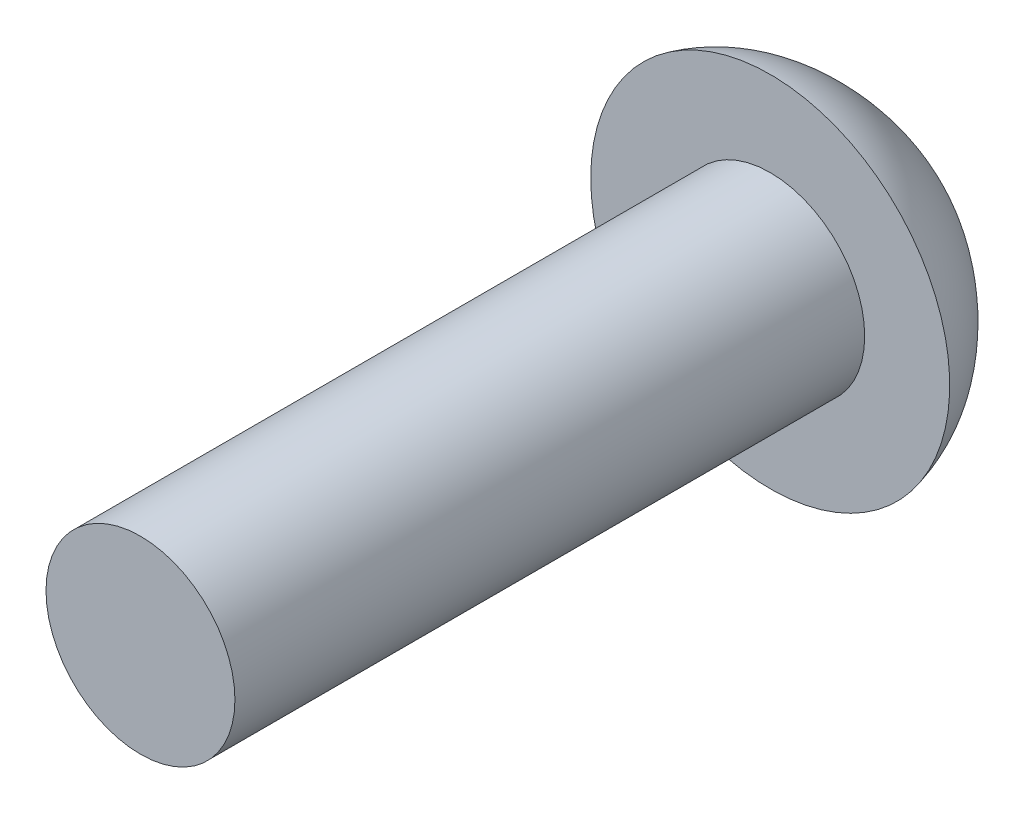
ISO-10303-21;
HEADER;
FILE_DESCRIPTION(('STEP AP214'),'2;1');
FILE_NAME('part.step','',(''),(''),'','','');
FILE_SCHEMA(('AUTOMOTIVE_DESIGN { 1 0 10303 214 1 1 1 1 }'));
ENDSEC;
DATA;
#1=APPLICATION_CONTEXT('core data for automotive mechanical design processes');
#2=APPLICATION_PROTOCOL_DEFINITION('international standard','automotive_design',2000,#1);
#3=PRODUCT_CONTEXT('',#1,'mechanical');
#4=PRODUCT('Part','Part','',(#3));
#5=PRODUCT_RELATED_PRODUCT_CATEGORY('part','',(#4));
#6=PRODUCT_DEFINITION_FORMATION('','',#4);
#7=PRODUCT_DEFINITION_CONTEXT('part definition',#1,'design');
#8=PRODUCT_DEFINITION('design','',#6,#7);
#9=PRODUCT_DEFINITION_SHAPE('','',#8);
#10=(LENGTH_UNIT() NAMED_UNIT(*) SI_UNIT(.MILLI.,.METRE.));
#11=(NAMED_UNIT(*) PLANE_ANGLE_UNIT() SI_UNIT($,.RADIAN.));
#12=(NAMED_UNIT(*) SI_UNIT($,.STERADIAN.) SOLID_ANGLE_UNIT());
#13=UNCERTAINTY_MEASURE_WITH_UNIT(LENGTH_MEASURE(1.E-05),#10,'distance_accuracy_value','');
#14=(GEOMETRIC_REPRESENTATION_CONTEXT(3) GLOBAL_UNCERTAINTY_ASSIGNED_CONTEXT((#13)) GLOBAL_UNIT_ASSIGNED_CONTEXT((#10,
#11,#12)) REPRESENTATION_CONTEXT('',''));
#15=CARTESIAN_POINT('',(0.,0.,0.));
#16=DIRECTION('',(0.,0.,1.));
#17=DIRECTION('',(1.,0.,0.));
#18=AXIS2_PLACEMENT_3D('',#15,#16,#17);
#19=CARTESIAN_POINT('',(0.,0.,0.));
#20=DIRECTION('',(0.,0.,-1.));
#21=DIRECTION('',(-1.,0.,0.));
#22=AXIS2_PLACEMENT_3D('',#19,#20,#21);
#23=PLANE('',#22);
#24=CARTESIAN_POINT('',(0.,0.,0.));
#25=DIRECTION('',(0.,0.,-1.));
#26=DIRECTION('',(-1.,0.,0.));
#27=AXIS2_PLACEMENT_3D('',#24,#25,#26);
#28=CIRCLE('',#27,1.5);
#29=CARTESIAN_POINT('',(-1.5,0.,0.));
#30=VERTEX_POINT('',#29);
#31=EDGE_CURVE('E11',#30,#30,#28,.T.);
#32=ORIENTED_EDGE('',*,*,#31,.F.);
#33=EDGE_LOOP('',(#32));
#34=FACE_BOUND('',#33,.T.);
#35=ADVANCED_FACE('F39',(#34),#23,.F.);
#36=CARTESIAN_POINT('',(0.,0.,-11.65));
#37=DIRECTION('',(0.,0.,-1.));
#38=DIRECTION('',(-1.,0.,0.));
#39=AXIS2_PLACEMENT_3D('',#36,#37,#38);
#40=CYLINDRICAL_SURFACE('',#39,1.5);
#41=CARTESIAN_POINT('',(0.,0.,-10.));
#42=DIRECTION('',(0.,0.,-1.));
#43=DIRECTION('',(-1.,0.,0.));
#44=AXIS2_PLACEMENT_3D('',#41,#42,#43);
#45=CIRCLE('',#44,1.5);
#46=CARTESIAN_POINT('',(-1.5,0.,-10.));
#47=VERTEX_POINT('',#46);
#48=EDGE_CURVE('E47',#47,#47,#45,.T.);
#49=ORIENTED_EDGE('',*,*,#48,.F.);
#50=EDGE_LOOP('',(#49));
#51=FACE_BOUND('',#50,.T.);
#52=ORIENTED_EDGE('',*,*,#31,.T.);
#53=EDGE_LOOP('',(#52));
#54=FACE_BOUND('',#53,.T.);
#55=ADVANCED_FACE('F181',(#51,#54),#40,.T.);
#56=CARTESIAN_POINT('',(1.5,0.,-10.));
#57=DIRECTION('',(0.,0.,-1.));
#58=DIRECTION('',(-1.,0.,0.));
#59=AXIS2_PLACEMENT_3D('',#56,#57,#58);
#60=PLANE('',#59);
#61=CARTESIAN_POINT('',(0.,0.,-10.));
#62=DIRECTION('',(0.,0.,-1.));
#63=DIRECTION('',(-1.,0.,0.));
#64=AXIS2_PLACEMENT_3D('',#61,#62,#63);
#65=CIRCLE('',#64,2.85);
#66=CARTESIAN_POINT('',(-2.85,0.,-10.));
#67=VERTEX_POINT('',#66);
#68=EDGE_CURVE('E195',#67,#67,#65,.T.);
#69=ORIENTED_EDGE('',*,*,#68,.F.);
#70=EDGE_LOOP('',(#69));
#71=FACE_BOUND('',#70,.T.);
#72=ORIENTED_EDGE('',*,*,#48,.T.);
#73=EDGE_LOOP('',(#72));
#74=FACE_BOUND('',#73,.T.);
#75=ADVANCED_FACE('F177',(#71,#74),#60,.F.);
#76=CARTESIAN_POINT('',(2.85,0.,-10.));
#77=CARTESIAN_POINT('',(2.63159564729313,0.,-10.9271725379561));
#78=CARTESIAN_POINT('',(1.5,0.,-11.65));
#79=B_SPLINE_CURVE_WITH_KNOTS('',2,(#76,#77,#78),.UNSPECIFIED.,.F.,.F.,(3,3),(0.,
0.48885509411615),.UNSPECIFIED.);
#80=CARTESIAN_POINT('',(0.,0.,-11.65));
#81=DIRECTION('',(0.,0.,-1.));
#82=AXIS1_PLACEMENT('',#80,#81);
#83=SURFACE_OF_REVOLUTION('',#79,#82);
#84=CARTESIAN_POINT('',(0.,0.,-11.65));
#85=DIRECTION('',(0.,0.,-1.));
#86=DIRECTION('',(-1.,0.,0.));
#87=AXIS2_PLACEMENT_3D('',#84,#85,#86);
#88=CIRCLE('',#87,1.5);
#89=CARTESIAN_POINT('',(-1.5,0.,-11.65));
#90=VERTEX_POINT('',#89);
#91=EDGE_CURVE('E153',#90,#90,#88,.T.);
#92=ORIENTED_EDGE('',*,*,#91,.F.);
#93=EDGE_LOOP('',(#92));
#94=FACE_BOUND('',#93,.T.);
#95=ORIENTED_EDGE('',*,*,#68,.T.);
#96=EDGE_LOOP('',(#95));
#97=FACE_BOUND('',#96,.T.);
#98=ADVANCED_FACE('F172',(#94,#97),#83,.T.);
#99=CARTESIAN_POINT('',(1.5,0.,-11.65));
#100=DIRECTION('',(0.,0.,1.));
#101=DIRECTION('',(1.,0.,0.));
#102=AXIS2_PLACEMENT_3D('',#99,#100,#101);
#103=PLANE('',#102);
#104=DIRECTION('',(0.999999896632299,-0.000454681637801801,0.));
#105=VECTOR('',#104,1.);
#106=CARTESIAN_POINT('',(-0.576895527872454,1.00026240719828,-11.65));
#107=LINE('',#106,#105);
#108=CARTESIAN_POINT('',(-0.576895527872454,1.00026240719828,-11.65));
#109=VERTEX_POINT('',#108);
#110=CARTESIAN_POINT('',(0.577804891148057,0.999737386066318,-11.65));
#111=VERTEX_POINT('',#110);
#112=EDGE_CURVE('E134',#109,#111,#107,.T.);
#113=ORIENTED_EDGE('',*,*,#112,.F.);
#114=DIRECTION('',(0.50039371416512,0.865797973446483,0.));
#115=VECTOR('',#114,1.);
#116=CARTESIAN_POINT('',(-1.15470041902051,0.000525021131960999,-11.65));
#117=LINE('',#116,#115);
#118=CARTESIAN_POINT('',(-1.15470041902051,0.000525021131960999,-11.65));
#119=VERTEX_POINT('',#118);
#120=EDGE_CURVE('E54',#119,#109,#117,.T.);
#121=ORIENTED_EDGE('',*,*,#120,.F.);
#122=DIRECTION('',(-0.499606182467179,0.866252655084284,0.));
#123=VECTOR('',#122,1.);
#124=CARTESIAN_POINT('',(-0.577804891148057,-0.999737386066318,-11.65));
#125=LINE('',#124,#123);
#126=CARTESIAN_POINT('',(-0.577804891148057,-0.999737386066318,-11.65));
#127=VERTEX_POINT('',#126);
#128=EDGE_CURVE('E147',#127,#119,#125,.T.);
#129=ORIENTED_EDGE('',*,*,#128,.F.);
#130=DIRECTION('',(-0.999999896632299,0.000454681637801989,0.));
#131=VECTOR('',#130,1.);
#132=CARTESIAN_POINT('',(0.576895527872454,-1.00026240719828,-11.65));
#133=LINE('',#132,#131);
#134=CARTESIAN_POINT('',(0.576895527872454,-1.00026240719828,-11.65));
#135=VERTEX_POINT('',#134);
#136=EDGE_CURVE('E144',#135,#127,#133,.T.);
#137=ORIENTED_EDGE('',*,*,#136,.F.);
#138=DIRECTION('',(-0.50039371416512,-0.865797973446482,0.));
#139=VECTOR('',#138,1.);
#140=CARTESIAN_POINT('',(1.15470041902051,-0.000525021131961326,-11.65));
#141=LINE('',#140,#139);
#142=CARTESIAN_POINT('',(1.15470041902051,-0.000525021131961326,-11.65));
#143=VERTEX_POINT('',#142);
#144=EDGE_CURVE('E102',#143,#135,#141,.T.);
#145=ORIENTED_EDGE('',*,*,#144,.F.);
#146=DIRECTION('',(0.499606182467179,-0.866252655084284,0.));
#147=VECTOR('',#146,1.);
#148=CARTESIAN_POINT('',(0.577804891148057,0.999737386066318,-11.65));
#149=LINE('',#148,#147);
#150=EDGE_CURVE('E138',#111,#143,#149,.T.);
#151=ORIENTED_EDGE('',*,*,#150,.F.);
#152=EDGE_LOOP('',(#113,#121,#129,#137,#145,#151));
#153=FACE_BOUND('',#152,.T.);
#154=ORIENTED_EDGE('',*,*,#91,.T.);
#155=EDGE_LOOP('',(#154));
#156=FACE_BOUND('',#155,.T.);
#157=ADVANCED_FACE('F176',(#153,#156),#103,.F.);
#158=CARTESIAN_POINT('',(-1.15470041902051,0.000525021131960999,-10.15));
#159=DIRECTION('',(-0.865797973446483,0.50039371416512,0.));
#160=DIRECTION('',(-0.50039371416512,-0.865797973446483,0.));
#161=AXIS2_PLACEMENT_3D('',#158,#159,#160);
#162=PLANE('',#161);
#163=ORIENTED_EDGE('',*,*,#120,.T.);
#164=DIRECTION('',(0.,0.,-1.));
#165=VECTOR('',#164,1.);
#166=CARTESIAN_POINT('',(-0.576895527872454,1.00026240719828,-10.15));
#167=LINE('',#166,#165);
#168=CARTESIAN_POINT('',(-0.576895527872454,1.00026240719828,-10.15));
#169=VERTEX_POINT('',#168);
#170=EDGE_CURVE('E84',#169,#109,#167,.T.);
#171=ORIENTED_EDGE('',*,*,#170,.F.);
#172=DIRECTION('',(0.50039371416512,0.865797973446483,0.));
#173=VECTOR('',#172,1.);
#174=CARTESIAN_POINT('',(-1.15470041902051,0.000525021131960999,-10.15));
#175=LINE('',#174,#173);
#176=CARTESIAN_POINT('',(-1.15470041902051,0.000525021131960999,-10.15));
#177=VERTEX_POINT('',#176);
#178=EDGE_CURVE('E150',#177,#169,#175,.T.);
#179=ORIENTED_EDGE('',*,*,#178,.F.);
#180=DIRECTION('',(0.,0.,-1.));
#181=VECTOR('',#180,1.);
#182=CARTESIAN_POINT('',(-1.15470041902051,0.000525021131960999,-10.15));
#183=LINE('',#182,#181);
#184=EDGE_CURVE('E62',#177,#119,#183,.T.);
#185=ORIENTED_EDGE('',*,*,#184,.T.);
#186=EDGE_LOOP('',(#163,#171,#179,#185));
#187=FACE_BOUND('',#186,.T.);
#188=ADVANCED_FACE('F205',(#187),#162,.F.);
#189=CARTESIAN_POINT('',(-0.577804891148057,-0.999737386066318,-10.15));
#190=DIRECTION('',(-0.866252655084284,-0.499606182467179,0.));
#191=DIRECTION('',(0.499606182467179,-0.866252655084285,0.));
#192=AXIS2_PLACEMENT_3D('',#189,#190,#191);
#193=PLANE('',#192);
#194=ORIENTED_EDGE('',*,*,#128,.T.);
#195=ORIENTED_EDGE('',*,*,#184,.F.);
#196=DIRECTION('',(-0.499606182467179,0.866252655084284,0.));
#197=VECTOR('',#196,1.);
#198=CARTESIAN_POINT('',(-0.577804891148057,-0.999737386066318,-10.15));
#199=LINE('',#198,#197);
#200=CARTESIAN_POINT('',(-0.577804891148057,-0.999737386066318,-10.15));
#201=VERTEX_POINT('',#200);
#202=EDGE_CURVE('E116',#201,#177,#199,.T.);
#203=ORIENTED_EDGE('',*,*,#202,.F.);
#204=DIRECTION('',(0.,0.,-1.));
#205=VECTOR('',#204,1.);
#206=CARTESIAN_POINT('',(-0.577804891148057,-0.999737386066318,-10.15));
#207=LINE('',#206,#205);
#208=EDGE_CURVE('E107',#201,#127,#207,.T.);
#209=ORIENTED_EDGE('',*,*,#208,.T.);
#210=EDGE_LOOP('',(#194,#195,#203,#209));
#211=FACE_BOUND('',#210,.T.);
#212=ADVANCED_FACE('F210',(#211),#193,.F.);
#213=CARTESIAN_POINT('',(0.576895527872454,-1.00026240719828,-10.15));
#214=DIRECTION('',(-0.000454681637801989,-0.999999896632299,0.));
#215=DIRECTION('',(0.999999896632299,-0.000454681637801989,0.));
#216=AXIS2_PLACEMENT_3D('',#213,#214,#215);
#217=PLANE('',#216);
#218=ORIENTED_EDGE('',*,*,#136,.T.);
#219=ORIENTED_EDGE('',*,*,#208,.F.);
#220=DIRECTION('',(-0.999999896632299,0.000454681637801989,0.));
#221=VECTOR('',#220,1.);
#222=CARTESIAN_POINT('',(0.576895527872454,-1.00026240719828,-10.15));
#223=LINE('',#222,#221);
#224=CARTESIAN_POINT('',(0.576895527872454,-1.00026240719828,-10.15));
#225=VERTEX_POINT('',#224);
#226=EDGE_CURVE('E111',#225,#201,#223,.T.);
#227=ORIENTED_EDGE('',*,*,#226,.F.);
#228=DIRECTION('',(0.,0.,-1.));
#229=VECTOR('',#228,1.);
#230=CARTESIAN_POINT('',(0.576895527872454,-1.00026240719828,-10.15));
#231=LINE('',#230,#229);
#232=EDGE_CURVE('E95',#225,#135,#231,.T.);
#233=ORIENTED_EDGE('',*,*,#232,.T.);
#234=EDGE_LOOP('',(#218,#219,#227,#233));
#235=FACE_BOUND('',#234,.T.);
#236=ADVANCED_FACE('F112',(#235),#217,.F.);
#237=CARTESIAN_POINT('',(1.15470041902051,-0.000525021131961326,-10.15));
#238=DIRECTION('',(0.865797973446482,-0.50039371416512,0.));
#239=DIRECTION('',(0.50039371416512,0.865797973446482,0.));
#240=AXIS2_PLACEMENT_3D('',#237,#238,#239);
#241=PLANE('',#240);
#242=ORIENTED_EDGE('',*,*,#144,.T.);
#243=ORIENTED_EDGE('',*,*,#232,.F.);
#244=DIRECTION('',(-0.50039371416512,-0.865797973446482,0.));
#245=VECTOR('',#244,1.);
#246=CARTESIAN_POINT('',(1.15470041902051,-0.000525021131961326,-10.15));
#247=LINE('',#246,#245);
#248=CARTESIAN_POINT('',(1.15470041902051,-0.000525021131961326,-10.15));
#249=VERTEX_POINT('',#248);
#250=EDGE_CURVE('E99',#249,#225,#247,.T.);
#251=ORIENTED_EDGE('',*,*,#250,.F.);
#252=DIRECTION('',(0.,0.,-1.));
#253=VECTOR('',#252,1.);
#254=CARTESIAN_POINT('',(1.15470041902051,-0.000525021131961326,-10.15));
#255=LINE('',#254,#253);
#256=EDGE_CURVE('E108',#249,#143,#255,.T.);
#257=ORIENTED_EDGE('',*,*,#256,.T.);
#258=EDGE_LOOP('',(#242,#243,#251,#257));
#259=FACE_BOUND('',#258,.T.);
#260=ADVANCED_FACE('F97',(#259),#241,.F.);
#261=CARTESIAN_POINT('',(0.577804891148057,0.999737386066318,-10.15));
#262=DIRECTION('',(0.866252655084285,0.499606182467179,0.));
#263=DIRECTION('',(-0.499606182467179,0.866252655084285,0.));
#264=AXIS2_PLACEMENT_3D('',#261,#262,#263);
#265=PLANE('',#264);
#266=ORIENTED_EDGE('',*,*,#150,.T.);
#267=ORIENTED_EDGE('',*,*,#256,.F.);
#268=DIRECTION('',(0.499606182467179,-0.866252655084284,0.));
#269=VECTOR('',#268,1.);
#270=CARTESIAN_POINT('',(0.577804891148057,0.999737386066318,-10.15));
#271=LINE('',#270,#269);
#272=CARTESIAN_POINT('',(0.577804891148057,0.999737386066318,-10.15));
#273=VERTEX_POINT('',#272);
#274=EDGE_CURVE('E122',#273,#249,#271,.T.);
#275=ORIENTED_EDGE('',*,*,#274,.F.);
#276=DIRECTION('',(0.,0.,-1.));
#277=VECTOR('',#276,1.);
#278=CARTESIAN_POINT('',(0.577804891148057,0.999737386066318,-10.15));
#279=LINE('',#278,#277);
#280=EDGE_CURVE('E158',#273,#111,#279,.T.);
#281=ORIENTED_EDGE('',*,*,#280,.T.);
#282=EDGE_LOOP('',(#266,#267,#275,#281));
#283=FACE_BOUND('',#282,.T.);
#284=ADVANCED_FACE('F229',(#283),#265,.F.);
#285=CARTESIAN_POINT('',(-0.576895527872454,1.00026240719828,-10.15));
#286=DIRECTION('',(0.000454681637801801,0.999999896632299,0.));
#287=DIRECTION('',(-0.999999896632299,0.000454681637801801,0.));
#288=AXIS2_PLACEMENT_3D('',#285,#286,#287);
#289=PLANE('',#288);
#290=ORIENTED_EDGE('',*,*,#112,.T.);
#291=ORIENTED_EDGE('',*,*,#280,.F.);
#292=DIRECTION('',(0.999999896632299,-0.000454681637801801,0.));
#293=VECTOR('',#292,1.);
#294=CARTESIAN_POINT('',(-0.576895527872454,1.00026240719828,-10.15));
#295=LINE('',#294,#293);
#296=EDGE_CURVE('E126',#169,#273,#295,.T.);
#297=ORIENTED_EDGE('',*,*,#296,.F.);
#298=ORIENTED_EDGE('',*,*,#170,.T.);
#299=EDGE_LOOP('',(#290,#291,#297,#298));
#300=FACE_BOUND('',#299,.T.);
#301=ADVANCED_FACE('F215',(#300),#289,.F.);
#302=CARTESIAN_POINT('',(0.,0.,-10.15));
#303=DIRECTION('',(0.,0.,-1.));
#304=DIRECTION('',(-1.,0.,0.));
#305=AXIS2_PLACEMENT_3D('',#302,#303,#304);
#306=PLANE('',#305);
#307=ORIENTED_EDGE('',*,*,#178,.T.);
#308=ORIENTED_EDGE('',*,*,#296,.T.);
#309=ORIENTED_EDGE('',*,*,#274,.T.);
#310=ORIENTED_EDGE('',*,*,#250,.T.);
#311=ORIENTED_EDGE('',*,*,#226,.T.);
#312=ORIENTED_EDGE('',*,*,#202,.T.);
#313=EDGE_LOOP('',(#307,#308,#309,#310,#311,#312));
#314=FACE_BOUND('',#313,.T.);
#315=ADVANCED_FACE('F119',(#314),#306,.T.);
#316=CLOSED_SHELL('',(#35,#55,#75,#98,#157,#188,#212,#236,#260,#284,#301,#315));
#317=MANIFOLD_SOLID_BREP('B2',#316);
#318=ADVANCED_BREP_SHAPE_REPRESENTATION('',(#18,#317),#14);
#319=SHAPE_DEFINITION_REPRESENTATION(#9,#318);
ENDSEC;
END-ISO-10303-21;
